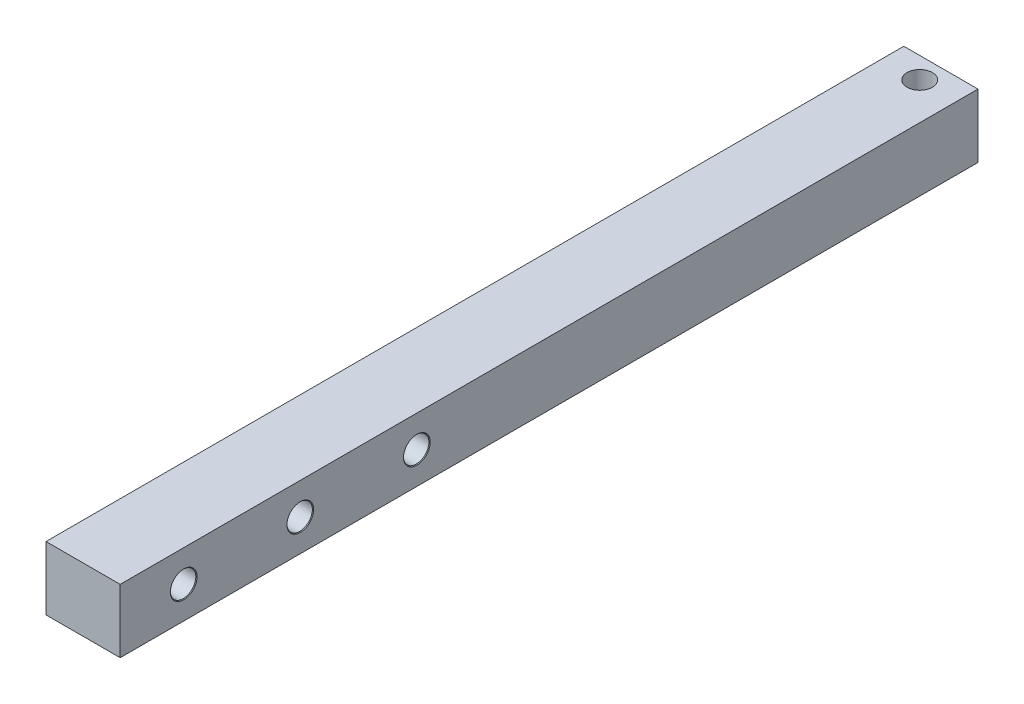
ISO-10303-21;
HEADER;
FILE_DESCRIPTION(('STEP AP214'),'2;1');
FILE_NAME('part.step','',(''),(''),'','','');
FILE_SCHEMA(('AUTOMOTIVE_DESIGN { 1 0 10303 214 1 1 1 1 }'));
ENDSEC;
DATA;
#1=APPLICATION_CONTEXT('core data for automotive mechanical design processes');
#2=APPLICATION_PROTOCOL_DEFINITION('international standard','automotive_design',2000,#1);
#3=PRODUCT_CONTEXT('',#1,'mechanical');
#4=PRODUCT('Part','Part','',(#3));
#5=PRODUCT_RELATED_PRODUCT_CATEGORY('part','',(#4));
#6=PRODUCT_DEFINITION_FORMATION('','',#4);
#7=PRODUCT_DEFINITION_CONTEXT('part definition',#1,'design');
#8=PRODUCT_DEFINITION('design','',#6,#7);
#9=PRODUCT_DEFINITION_SHAPE('','',#8);
#10=(LENGTH_UNIT() NAMED_UNIT(*) SI_UNIT(.MILLI.,.METRE.));
#11=(NAMED_UNIT(*) PLANE_ANGLE_UNIT() SI_UNIT($,.RADIAN.));
#12=(NAMED_UNIT(*) SI_UNIT($,.STERADIAN.) SOLID_ANGLE_UNIT());
#13=UNCERTAINTY_MEASURE_WITH_UNIT(LENGTH_MEASURE(1.E-05),#10,'distance_accuracy_value','');
#14=(GEOMETRIC_REPRESENTATION_CONTEXT(3) GLOBAL_UNCERTAINTY_ASSIGNED_CONTEXT((#13)) GLOBAL_UNIT_ASSIGNED_CONTEXT((#10,
#11,#12)) REPRESENTATION_CONTEXT('',''));
#15=CARTESIAN_POINT('',(0.,0.,0.));
#16=DIRECTION('',(0.,0.,1.));
#17=DIRECTION('',(1.,0.,0.));
#18=AXIS2_PLACEMENT_3D('',#15,#16,#17);
#19=CARTESIAN_POINT('',(-2.77965672742993,-14.3289989888922,202.4));
#20=DIRECTION('',(1.,0.,0.));
#21=DIRECTION('',(0.,1.,0.));
#22=AXIS2_PLACEMENT_3D('',#19,#20,#21);
#23=PLANE('',#22);
#24=CARTESIAN_POINT('',(-2.77965672742993,-29.3289989888922,172.4));
#25=DIRECTION('',(1.,0.,0.));
#26=DIRECTION('',(0.,1.,0.));
#27=AXIS2_PLACEMENT_3D('',#24,#25,#26);
#28=CIRCLE('',#27,6.29999999999991);
#29=CARTESIAN_POINT('',(-2.77965672742993,-23.0289989888923,172.4));
#30=VERTEX_POINT('',#29);
#31=EDGE_CURVE('E11',#30,#30,#28,.T.);
#32=ORIENTED_EDGE('',*,*,#31,.T.);
#33=EDGE_LOOP('',(#32));
#34=FACE_BOUND('',#33,.T.);
#35=CARTESIAN_POINT('',(-2.77965672742993,-29.3289989888922,62.4));
#36=DIRECTION('',(1.,0.,0.));
#37=DIRECTION('',(0.,1.,0.));
#38=AXIS2_PLACEMENT_3D('',#35,#36,#37);
#39=CIRCLE('',#38,6.30000000000002);
#40=CARTESIAN_POINT('',(-2.77965672742993,-23.0289989888922,62.4));
#41=VERTEX_POINT('',#40);
#42=EDGE_CURVE('E43',#41,#41,#39,.T.);
#43=ORIENTED_EDGE('',*,*,#42,.T.);
#44=EDGE_LOOP('',(#43));
#45=FACE_BOUND('',#44,.T.);
#46=CARTESIAN_POINT('',(-2.77965672742993,-29.3289989888922,117.4));
#47=DIRECTION('',(1.,0.,0.));
#48=DIRECTION('',(0.,1.,0.));
#49=AXIS2_PLACEMENT_3D('',#46,#47,#48);
#50=CIRCLE('',#49,6.30000000000002);
#51=CARTESIAN_POINT('',(-2.77965672742993,-23.0289989888922,117.4));
#52=VERTEX_POINT('',#51);
#53=EDGE_CURVE('E139',#52,#52,#50,.T.);
#54=ORIENTED_EDGE('',*,*,#53,.T.);
#55=EDGE_LOOP('',(#54));
#56=FACE_BOUND('',#55,.T.);
#57=DIRECTION('',(0.,-1.,0.));
#58=VECTOR('',#57,1.);
#59=CARTESIAN_POINT('',(-2.77965672742993,-14.3289989888922,-202.4));
#60=LINE('',#59,#58);
#61=CARTESIAN_POINT('',(-2.77965672742993,-14.3289989888922,-202.4));
#62=VERTEX_POINT('',#61);
#63=CARTESIAN_POINT('',(-2.77965672742993,-44.3289989888922,-202.4));
#64=VERTEX_POINT('',#63);
#65=EDGE_CURVE('E102',#62,#64,#60,.T.);
#66=ORIENTED_EDGE('',*,*,#65,.T.);
#67=DIRECTION('',(0.,0.,-1.));
#68=VECTOR('',#67,1.);
#69=CARTESIAN_POINT('',(-2.77965672742993,-44.3289989888922,202.4));
#70=LINE('',#69,#68);
#71=CARTESIAN_POINT('',(-2.77965672742993,-44.3289989888922,202.4));
#72=VERTEX_POINT('',#71);
#73=EDGE_CURVE('E93',#72,#64,#70,.T.);
#74=ORIENTED_EDGE('',*,*,#73,.F.);
#75=DIRECTION('',(0.,-1.,0.));
#76=VECTOR('',#75,1.);
#77=CARTESIAN_POINT('',(-2.77965672742993,-14.3289989888922,202.4));
#78=LINE('',#77,#76);
#79=CARTESIAN_POINT('',(-2.77965672742993,-14.3289989888922,202.4));
#80=VERTEX_POINT('',#79);
#81=EDGE_CURVE('E87',#80,#72,#78,.T.);
#82=ORIENTED_EDGE('',*,*,#81,.F.);
#83=DIRECTION('',(0.,0.,-1.));
#84=VECTOR('',#83,1.);
#85=CARTESIAN_POINT('',(-2.77965672742993,-14.3289989888922,202.4));
#86=LINE('',#85,#84);
#87=EDGE_CURVE('E98',#80,#62,#86,.T.);
#88=ORIENTED_EDGE('',*,*,#87,.T.);
#89=EDGE_LOOP('',(#66,#74,#82,#88));
#90=FACE_BOUND('',#89,.T.);
#91=ADVANCED_FACE('F34',(#34,#45,#56,#90),#23,.F.);
#92=CARTESIAN_POINT('',(-2.77965672742993,-44.3289989888922,202.4));
#93=DIRECTION('',(0.,1.,0.));
#94=DIRECTION('',(0.,0.,1.));
#95=AXIS2_PLACEMENT_3D('',#92,#93,#94);
#96=PLANE('',#95);
#97=CARTESIAN_POINT('',(14.7203432725701,-44.3289989888922,-192.4));
#98=DIRECTION('',(0.,1.,0.));
#99=DIRECTION('',(0.,0.,1.));
#100=AXIS2_PLACEMENT_3D('',#97,#98,#99);
#101=CIRCLE('',#100,6.);
#102=CARTESIAN_POINT('',(14.7203432725701,-44.3289989888922,-186.4));
#103=VERTEX_POINT('',#102);
#104=EDGE_CURVE('E105',#103,#103,#101,.T.);
#105=ORIENTED_EDGE('',*,*,#104,.T.);
#106=EDGE_LOOP('',(#105));
#107=FACE_BOUND('',#106,.T.);
#108=DIRECTION('',(1.,0.,0.));
#109=VECTOR('',#108,1.);
#110=CARTESIAN_POINT('',(-2.77965672742993,-44.3289989888922,-202.4));
#111=LINE('',#110,#109);
#112=CARTESIAN_POINT('',(32.2203432725701,-44.3289989888922,-202.4));
#113=VERTEX_POINT('',#112);
#114=EDGE_CURVE('E92',#64,#113,#111,.T.);
#115=ORIENTED_EDGE('',*,*,#114,.T.);
#116=DIRECTION('',(0.,0.,-1.));
#117=VECTOR('',#116,1.);
#118=CARTESIAN_POINT('',(32.2203432725701,-44.3289989888922,202.4));
#119=LINE('',#118,#117);
#120=CARTESIAN_POINT('',(32.2203432725701,-44.3289989888922,202.4));
#121=VERTEX_POINT('',#120);
#122=EDGE_CURVE('E90',#121,#113,#119,.T.);
#123=ORIENTED_EDGE('',*,*,#122,.F.);
#124=DIRECTION('',(1.,0.,0.));
#125=VECTOR('',#124,1.);
#126=CARTESIAN_POINT('',(-2.77965672742993,-44.3289989888922,202.4));
#127=LINE('',#126,#125);
#128=EDGE_CURVE('E82',#72,#121,#127,.T.);
#129=ORIENTED_EDGE('',*,*,#128,.F.);
#130=ORIENTED_EDGE('',*,*,#73,.T.);
#131=EDGE_LOOP('',(#115,#123,#129,#130));
#132=FACE_BOUND('',#131,.T.);
#133=ADVANCED_FACE('F91',(#107,#132),#96,.F.);
#134=CARTESIAN_POINT('',(32.2203432725701,-14.3289989888922,202.4));
#135=DIRECTION('',(-1.,0.,0.));
#136=DIRECTION('',(0.,0.,1.));
#137=AXIS2_PLACEMENT_3D('',#134,#135,#136);
#138=PLANE('',#137);
#139=CARTESIAN_POINT('',(32.2203432725701,-29.3289989888922,62.4));
#140=DIRECTION('',(-1.,0.,0.));
#141=DIRECTION('',(0.,0.,1.));
#142=AXIS2_PLACEMENT_3D('',#139,#140,#141);
#143=CIRCLE('',#142,6.29999999999998);
#144=CARTESIAN_POINT('',(32.2203432725701,-29.3289989888922,68.7));
#145=VERTEX_POINT('',#144);
#146=EDGE_CURVE('E118',#145,#145,#143,.T.);
#147=ORIENTED_EDGE('',*,*,#146,.T.);
#148=EDGE_LOOP('',(#147));
#149=FACE_BOUND('',#148,.T.);
#150=CARTESIAN_POINT('',(32.2203432725701,-29.3289989888922,117.4));
#151=DIRECTION('',(-1.,0.,0.));
#152=DIRECTION('',(0.,0.,1.));
#153=AXIS2_PLACEMENT_3D('',#150,#151,#152);
#154=CIRCLE('',#153,6.29999999999998);
#155=CARTESIAN_POINT('',(32.2203432725701,-29.3289989888922,123.7));
#156=VERTEX_POINT('',#155);
#157=EDGE_CURVE('E115',#156,#156,#154,.T.);
#158=ORIENTED_EDGE('',*,*,#157,.T.);
#159=EDGE_LOOP('',(#158));
#160=FACE_BOUND('',#159,.T.);
#161=CARTESIAN_POINT('',(32.2203432725701,-29.3289989888922,172.4));
#162=DIRECTION('',(-1.,0.,0.));
#163=DIRECTION('',(0.,0.,1.));
#164=AXIS2_PLACEMENT_3D('',#161,#162,#163);
#165=CIRCLE('',#164,6.29999999999998);
#166=CARTESIAN_POINT('',(32.2203432725701,-29.3289989888922,178.7));
#167=VERTEX_POINT('',#166);
#168=EDGE_CURVE('E112',#167,#167,#165,.T.);
#169=ORIENTED_EDGE('',*,*,#168,.T.);
#170=EDGE_LOOP('',(#169));
#171=FACE_BOUND('',#170,.T.);
#172=DIRECTION('',(0.,1.,0.));
#173=VECTOR('',#172,1.);
#174=CARTESIAN_POINT('',(32.2203432725701,-14.3289989888922,-202.4));
#175=LINE('',#174,#173);
#176=CARTESIAN_POINT('',(32.2203432725701,-14.3289989888922,-202.4));
#177=VERTEX_POINT('',#176);
#178=EDGE_CURVE('E68',#113,#177,#175,.T.);
#179=ORIENTED_EDGE('',*,*,#178,.T.);
#180=DIRECTION('',(0.,0.,-1.));
#181=VECTOR('',#180,1.);
#182=CARTESIAN_POINT('',(32.2203432725701,-14.3289989888922,202.4));
#183=LINE('',#182,#181);
#184=CARTESIAN_POINT('',(32.2203432725701,-14.3289989888922,202.4));
#185=VERTEX_POINT('',#184);
#186=EDGE_CURVE('E94',#185,#177,#183,.T.);
#187=ORIENTED_EDGE('',*,*,#186,.F.);
#188=DIRECTION('',(0.,1.,0.));
#189=VECTOR('',#188,1.);
#190=CARTESIAN_POINT('',(32.2203432725701,-14.3289989888922,202.4));
#191=LINE('',#190,#189);
#192=EDGE_CURVE('E85',#121,#185,#191,.T.);
#193=ORIENTED_EDGE('',*,*,#192,.F.);
#194=ORIENTED_EDGE('',*,*,#122,.T.);
#195=EDGE_LOOP('',(#179,#187,#193,#194));
#196=FACE_BOUND('',#195,.T.);
#197=ADVANCED_FACE('F96',(#149,#160,#171,#196),#138,.F.);
#198=CARTESIAN_POINT('',(-2.77965672742993,-14.3289989888922,202.4));
#199=DIRECTION('',(0.,-1.,0.));
#200=DIRECTION('',(0.,0.,-1.));
#201=AXIS2_PLACEMENT_3D('',#198,#199,#200);
#202=PLANE('',#201);
#203=CARTESIAN_POINT('',(14.7203432725701,-14.3289989888922,-192.4));
#204=DIRECTION('',(0.,1.,0.));
#205=DIRECTION('',(0.,0.,1.));
#206=AXIS2_PLACEMENT_3D('',#203,#204,#205);
#207=CIRCLE('',#206,6.);
#208=CARTESIAN_POINT('',(14.7203432725701,-14.3289989888922,-186.4));
#209=VERTEX_POINT('',#208);
#210=EDGE_CURVE('E310',#209,#209,#207,.T.);
#211=ORIENTED_EDGE('',*,*,#210,.F.);
#212=EDGE_LOOP('',(#211));
#213=FACE_BOUND('',#212,.T.);
#214=DIRECTION('',(-1.,0.,0.));
#215=VECTOR('',#214,1.);
#216=CARTESIAN_POINT('',(-2.77965672742993,-14.3289989888922,-202.4));
#217=LINE('',#216,#215);
#218=EDGE_CURVE('E74',#177,#62,#217,.T.);
#219=ORIENTED_EDGE('',*,*,#218,.T.);
#220=ORIENTED_EDGE('',*,*,#87,.F.);
#221=DIRECTION('',(-1.,0.,0.));
#222=VECTOR('',#221,1.);
#223=CARTESIAN_POINT('',(-2.77965672742993,-14.3289989888922,202.4));
#224=LINE('',#223,#222);
#225=EDGE_CURVE('E51',#185,#80,#224,.T.);
#226=ORIENTED_EDGE('',*,*,#225,.F.);
#227=ORIENTED_EDGE('',*,*,#186,.T.);
#228=EDGE_LOOP('',(#219,#220,#226,#227));
#229=FACE_BOUND('',#228,.T.);
#230=ADVANCED_FACE('F271',(#213,#229),#202,.F.);
#231=CARTESIAN_POINT('',(0.,0.,202.4));
#232=DIRECTION('',(0.,0.,1.));
#233=DIRECTION('',(1.,0.,0.));
#234=AXIS2_PLACEMENT_3D('',#231,#232,#233);
#235=PLANE('',#234);
#236=ORIENTED_EDGE('',*,*,#81,.T.);
#237=ORIENTED_EDGE('',*,*,#128,.T.);
#238=ORIENTED_EDGE('',*,*,#192,.T.);
#239=ORIENTED_EDGE('',*,*,#225,.T.);
#240=EDGE_LOOP('',(#236,#237,#238,#239));
#241=FACE_BOUND('',#240,.T.);
#242=ADVANCED_FACE('F83',(#241),#235,.T.);
#243=CARTESIAN_POINT('',(0.,0.,-202.4));
#244=DIRECTION('',(0.,0.,1.));
#245=DIRECTION('',(1.,0.,0.));
#246=AXIS2_PLACEMENT_3D('',#243,#244,#245);
#247=PLANE('',#246);
#248=ORIENTED_EDGE('',*,*,#65,.F.);
#249=ORIENTED_EDGE('',*,*,#218,.F.);
#250=ORIENTED_EDGE('',*,*,#178,.F.);
#251=ORIENTED_EDGE('',*,*,#114,.F.);
#252=EDGE_LOOP('',(#248,#249,#250,#251));
#253=FACE_BOUND('',#252,.T.);
#254=ADVANCED_FACE('F165',(#253),#247,.F.);
#255=CARTESIAN_POINT('',(32.2203432725701,-29.3289989888922,172.4));
#256=DIRECTION('',(-1.,0.,0.));
#257=DIRECTION('',(0.,-1.,0.));
#258=AXIS2_PLACEMENT_3D('',#255,#256,#257);
#259=CYLINDRICAL_SURFACE('',#258,5.99999999999999);
#260=CARTESIAN_POINT('',(31.9203432725701,-29.3289989888922,172.4));
#261=DIRECTION('',(-1.,0.,0.));
#262=DIRECTION('',(0.,0.,1.));
#263=AXIS2_PLACEMENT_3D('',#260,#261,#262);
#264=CIRCLE('',#263,5.99999999999999);
#265=CARTESIAN_POINT('',(31.9203432725701,-29.3289989888922,178.4));
#266=VERTEX_POINT('',#265);
#267=EDGE_CURVE('E136',#266,#266,#264,.F.);
#268=ORIENTED_EDGE('',*,*,#267,.T.);
#269=EDGE_LOOP('',(#268));
#270=FACE_BOUND('',#269,.T.);
#271=CARTESIAN_POINT('',(-2.47965672742999,-29.3289989888922,172.4));
#272=DIRECTION('',(1.,0.,0.));
#273=DIRECTION('',(0.,0.,-1.));
#274=AXIS2_PLACEMENT_3D('',#271,#272,#273);
#275=CIRCLE('',#274,5.99999999999999);
#276=CARTESIAN_POINT('',(-2.47965672742999,-29.3289989888922,166.4));
#277=VERTEX_POINT('',#276);
#278=EDGE_CURVE('E133',#277,#277,#275,.F.);
#279=ORIENTED_EDGE('',*,*,#278,.T.);
#280=EDGE_LOOP('',(#279));
#281=FACE_BOUND('',#280,.T.);
#282=ADVANCED_FACE('F155',(#270,#281),#259,.F.);
#283=CARTESIAN_POINT('',(32.2203432725701,-29.3289989888922,62.4));
#284=DIRECTION('',(-1.,0.,0.));
#285=DIRECTION('',(0.,-1.,0.));
#286=AXIS2_PLACEMENT_3D('',#283,#284,#285);
#287=CYLINDRICAL_SURFACE('',#286,6.00000000000002);
#288=CARTESIAN_POINT('',(31.9203432725701,-29.3289989888922,62.4));
#289=DIRECTION('',(-1.,0.,0.));
#290=DIRECTION('',(0.,0.,1.));
#291=AXIS2_PLACEMENT_3D('',#288,#289,#290);
#292=CIRCLE('',#291,6.00000000000002);
#293=CARTESIAN_POINT('',(31.9203432725701,-29.3289989888922,68.4));
#294=VERTEX_POINT('',#293);
#295=EDGE_CURVE('E124',#294,#294,#292,.F.);
#296=ORIENTED_EDGE('',*,*,#295,.T.);
#297=EDGE_LOOP('',(#296));
#298=FACE_BOUND('',#297,.T.);
#299=CARTESIAN_POINT('',(-2.47965672742997,-29.3289989888922,62.4));
#300=DIRECTION('',(1.,0.,0.));
#301=DIRECTION('',(0.,0.,-1.));
#302=AXIS2_PLACEMENT_3D('',#299,#300,#301);
#303=CIRCLE('',#302,6.00000000000002);
#304=CARTESIAN_POINT('',(-2.47965672742997,-29.3289989888922,56.4));
#305=VERTEX_POINT('',#304);
#306=EDGE_CURVE('E121',#305,#305,#303,.F.);
#307=ORIENTED_EDGE('',*,*,#306,.T.);
#308=EDGE_LOOP('',(#307));
#309=FACE_BOUND('',#308,.T.);
#310=ADVANCED_FACE('F152',(#298,#309),#287,.F.);
#311=CARTESIAN_POINT('',(32.2203432725701,-29.3289989888922,117.4));
#312=DIRECTION('',(-1.,0.,0.));
#313=DIRECTION('',(0.,-1.,0.));
#314=AXIS2_PLACEMENT_3D('',#311,#312,#313);
#315=CYLINDRICAL_SURFACE('',#314,6.00000000000002);
#316=CARTESIAN_POINT('',(31.9203432725701,-29.3289989888922,117.4));
#317=DIRECTION('',(-1.,0.,0.));
#318=DIRECTION('',(0.,0.,1.));
#319=AXIS2_PLACEMENT_3D('',#316,#317,#318);
#320=CIRCLE('',#319,6.00000000000002);
#321=CARTESIAN_POINT('',(31.9203432725701,-29.3289989888922,123.4));
#322=VERTEX_POINT('',#321);
#323=EDGE_CURVE('E130',#322,#322,#320,.F.);
#324=ORIENTED_EDGE('',*,*,#323,.T.);
#325=EDGE_LOOP('',(#324));
#326=FACE_BOUND('',#325,.T.);
#327=CARTESIAN_POINT('',(-2.47965672742997,-29.3289989888922,117.4));
#328=DIRECTION('',(1.,0.,0.));
#329=DIRECTION('',(0.,0.,-1.));
#330=AXIS2_PLACEMENT_3D('',#327,#328,#329);
#331=CIRCLE('',#330,6.00000000000002);
#332=CARTESIAN_POINT('',(-2.47965672742997,-29.3289989888922,111.4));
#333=VERTEX_POINT('',#332);
#334=EDGE_CURVE('E127',#333,#333,#331,.F.);
#335=ORIENTED_EDGE('',*,*,#334,.T.);
#336=EDGE_LOOP('',(#335));
#337=FACE_BOUND('',#336,.T.);
#338=ADVANCED_FACE('F154',(#326,#337),#315,.F.);
#339=CARTESIAN_POINT('',(14.7203432725701,-44.3289989888922,-192.4));
#340=DIRECTION('',(0.,1.,0.));
#341=DIRECTION('',(0.,0.,1.));
#342=AXIS2_PLACEMENT_3D('',#339,#340,#341);
#343=CYLINDRICAL_SURFACE('',#342,6.);
#344=ORIENTED_EDGE('',*,*,#104,.F.);
#345=EDGE_LOOP('',(#344));
#346=FACE_BOUND('',#345,.T.);
#347=ORIENTED_EDGE('',*,*,#210,.T.);
#348=EDGE_LOOP('',(#347));
#349=FACE_BOUND('',#348,.T.);
#350=ADVANCED_FACE('F162',(#346,#349),#343,.F.);
#351=CARTESIAN_POINT('',(32.2203432725701,-29.3289989888922,62.4));
#352=DIRECTION('',(1.,0.,0.));
#353=DIRECTION('',(0.,0.,-1.));
#354=AXIS2_PLACEMENT_3D('',#351,#352,#353);
#355=CONICAL_SURFACE('',#354,6.29999999999998,0.785398163397412);
#356=ORIENTED_EDGE('',*,*,#295,.F.);
#357=EDGE_LOOP('',(#356));
#358=FACE_BOUND('',#357,.T.);
#359=ORIENTED_EDGE('',*,*,#146,.F.);
#360=EDGE_LOOP('',(#359));
#361=FACE_BOUND('',#360,.T.);
#362=ADVANCED_FACE('F178',(#358,#361),#355,.F.);
#363=CARTESIAN_POINT('',(32.2203432725701,-29.3289989888922,117.4));
#364=DIRECTION('',(1.,0.,0.));
#365=DIRECTION('',(0.,0.,-1.));
#366=AXIS2_PLACEMENT_3D('',#363,#364,#365);
#367=CONICAL_SURFACE('',#366,6.29999999999998,0.785398163397412);
#368=ORIENTED_EDGE('',*,*,#323,.F.);
#369=EDGE_LOOP('',(#368));
#370=FACE_BOUND('',#369,.T.);
#371=ORIENTED_EDGE('',*,*,#157,.F.);
#372=EDGE_LOOP('',(#371));
#373=FACE_BOUND('',#372,.T.);
#374=ADVANCED_FACE('F181',(#370,#373),#367,.F.);
#375=CARTESIAN_POINT('',(32.2203432725701,-29.3289989888922,172.4));
#376=DIRECTION('',(1.,0.,0.));
#377=DIRECTION('',(0.,0.,-1.));
#378=AXIS2_PLACEMENT_3D('',#375,#376,#377);
#379=CONICAL_SURFACE('',#378,6.29999999999998,0.785398163397415);
#380=ORIENTED_EDGE('',*,*,#267,.F.);
#381=EDGE_LOOP('',(#380));
#382=FACE_BOUND('',#381,.T.);
#383=ORIENTED_EDGE('',*,*,#168,.F.);
#384=EDGE_LOOP('',(#383));
#385=FACE_BOUND('',#384,.T.);
#386=ADVANCED_FACE('F185',(#382,#385),#379,.F.);
#387=CARTESIAN_POINT('',(-2.47965672742999,-29.3289989888922,172.4));
#388=DIRECTION('',(-1.,0.,0.));
#389=DIRECTION('',(0.,0.,1.));
#390=AXIS2_PLACEMENT_3D('',#387,#388,#389);
#391=CONICAL_SURFACE('',#390,5.99999999999999,0.785398163397422);
#392=ORIENTED_EDGE('',*,*,#31,.F.);
#393=EDGE_LOOP('',(#392));
#394=FACE_BOUND('',#393,.T.);
#395=ORIENTED_EDGE('',*,*,#278,.F.);
#396=EDGE_LOOP('',(#395));
#397=FACE_BOUND('',#396,.T.);
#398=ADVANCED_FACE('F149',(#394,#397),#391,.F.);
#399=CARTESIAN_POINT('',(-2.47965672742997,-29.3289989888922,62.4));
#400=DIRECTION('',(-1.,0.,0.));
#401=DIRECTION('',(0.,0.,1.));
#402=AXIS2_PLACEMENT_3D('',#399,#400,#401);
#403=CONICAL_SURFACE('',#402,6.00000000000002,0.785398163397518);
#404=ORIENTED_EDGE('',*,*,#42,.F.);
#405=EDGE_LOOP('',(#404));
#406=FACE_BOUND('',#405,.T.);
#407=ORIENTED_EDGE('',*,*,#306,.F.);
#408=EDGE_LOOP('',(#407));
#409=FACE_BOUND('',#408,.T.);
#410=ADVANCED_FACE('F146',(#406,#409),#403,.F.);
#411=CARTESIAN_POINT('',(-2.47965672742997,-29.3289989888922,117.4));
#412=DIRECTION('',(-1.,0.,0.));
#413=DIRECTION('',(0.,0.,1.));
#414=AXIS2_PLACEMENT_3D('',#411,#412,#413);
#415=CONICAL_SURFACE('',#414,6.00000000000002,0.785398163397518);
#416=ORIENTED_EDGE('',*,*,#53,.F.);
#417=EDGE_LOOP('',(#416));
#418=FACE_BOUND('',#417,.T.);
#419=ORIENTED_EDGE('',*,*,#334,.F.);
#420=EDGE_LOOP('',(#419));
#421=FACE_BOUND('',#420,.T.);
#422=ADVANCED_FACE('F36',(#418,#421),#415,.F.);
#423=CLOSED_SHELL('',(#91,#133,#197,#230,#242,#254,#282,#310,#338,#350,#362,#374,#386,#398,#410,#422));
#424=MANIFOLD_SOLID_BREP('B2',#423);
#425=ADVANCED_BREP_SHAPE_REPRESENTATION('',(#18,#424),#14);
#426=SHAPE_DEFINITION_REPRESENTATION(#9,#425);
ENDSEC;
END-ISO-10303-21;
